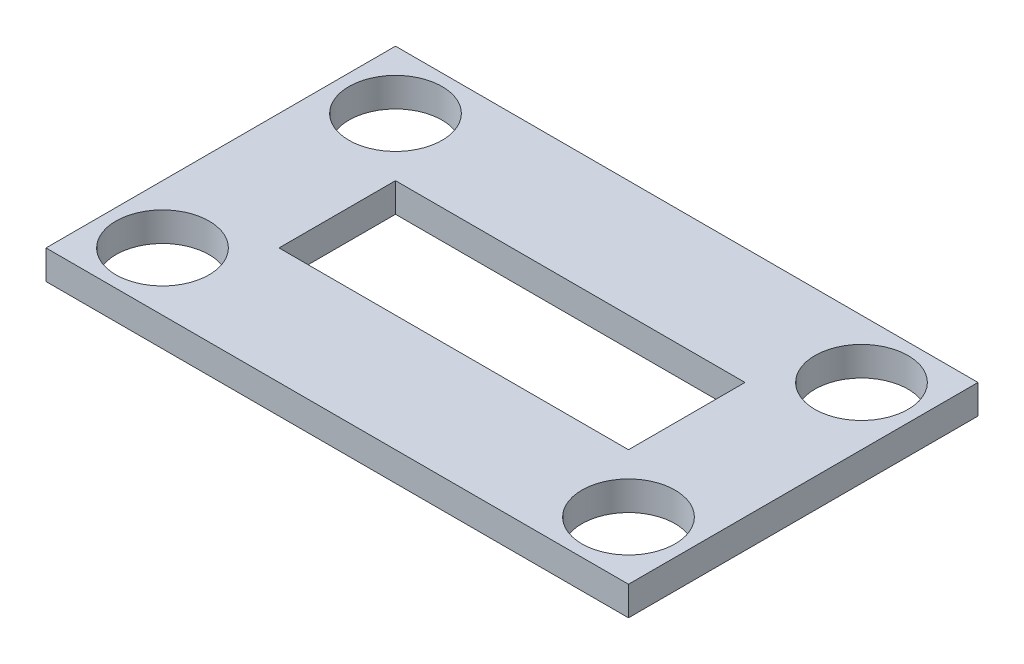
ISO-10303-21;
HEADER;
FILE_DESCRIPTION(('STEP AP214'),'2;1');
FILE_NAME('part.step','',(''),(''),'','','');
FILE_SCHEMA(('AUTOMOTIVE_DESIGN { 1 0 10303 214 1 1 1 1 }'));
ENDSEC;
DATA;
#1=APPLICATION_CONTEXT('core data for automotive mechanical design processes');
#2=APPLICATION_PROTOCOL_DEFINITION('international standard','automotive_design',2000,#1);
#3=PRODUCT_CONTEXT('',#1,'mechanical');
#4=PRODUCT('Part','Part','',(#3));
#5=PRODUCT_RELATED_PRODUCT_CATEGORY('part','',(#4));
#6=PRODUCT_DEFINITION_FORMATION('','',#4);
#7=PRODUCT_DEFINITION_CONTEXT('part definition',#1,'design');
#8=PRODUCT_DEFINITION('design','',#6,#7);
#9=PRODUCT_DEFINITION_SHAPE('','',#8);
#10=(LENGTH_UNIT() NAMED_UNIT(*) SI_UNIT(.MILLI.,.METRE.));
#11=(NAMED_UNIT(*) PLANE_ANGLE_UNIT() SI_UNIT($,.RADIAN.));
#12=(NAMED_UNIT(*) SI_UNIT($,.STERADIAN.) SOLID_ANGLE_UNIT());
#13=UNCERTAINTY_MEASURE_WITH_UNIT(LENGTH_MEASURE(1.E-05),#10,'distance_accuracy_value','');
#14=(GEOMETRIC_REPRESENTATION_CONTEXT(3) GLOBAL_UNCERTAINTY_ASSIGNED_CONTEXT((#13)) GLOBAL_UNIT_ASSIGNED_CONTEXT((#10,
#11,#12)) REPRESENTATION_CONTEXT('',''));
#15=CARTESIAN_POINT('',(0.,0.,0.));
#16=DIRECTION('',(0.,0.,1.));
#17=DIRECTION('',(1.,0.,0.));
#18=AXIS2_PLACEMENT_3D('',#15,#16,#17);
#19=CARTESIAN_POINT('',(0.,2.5,-15.));
#20=DIRECTION('',(0.,0.,1.));
#21=DIRECTION('',(1.,0.,0.));
#22=AXIS2_PLACEMENT_3D('',#19,#20,#21);
#23=PLANE('',#22);
#24=DIRECTION('',(-1.,0.,0.));
#25=VECTOR('',#24,1.);
#26=CARTESIAN_POINT('',(0.,0.,-15.));
#27=LINE('',#26,#25);
#28=CARTESIAN_POINT('',(25.,0.,-15.));
#29=VERTEX_POINT('',#28);
#30=CARTESIAN_POINT('',(-25.,0.,-15.));
#31=VERTEX_POINT('',#30);
#32=EDGE_CURVE('E163',#29,#31,#27,.T.);
#33=ORIENTED_EDGE('',*,*,#32,.T.);
#34=DIRECTION('',(0.,-1.,0.));
#35=VECTOR('',#34,1.);
#36=CARTESIAN_POINT('',(-25.,2.5,-15.));
#37=LINE('',#36,#35);
#38=CARTESIAN_POINT('',(-25.,2.5,-15.));
#39=VERTEX_POINT('',#38);
#40=EDGE_CURVE('E179',#39,#31,#37,.T.);
#41=ORIENTED_EDGE('',*,*,#40,.F.);
#42=DIRECTION('',(-1.,0.,0.));
#43=VECTOR('',#42,1.);
#44=CARTESIAN_POINT('',(0.,2.5,-15.));
#45=LINE('',#44,#43);
#46=CARTESIAN_POINT('',(25.,2.5,-15.));
#47=VERTEX_POINT('',#46);
#48=EDGE_CURVE('E142',#47,#39,#45,.T.);
#49=ORIENTED_EDGE('',*,*,#48,.F.);
#50=DIRECTION('',(0.,-1.,0.));
#51=VECTOR('',#50,1.);
#52=CARTESIAN_POINT('',(25.,2.5,-15.));
#53=LINE('',#52,#51);
#54=EDGE_CURVE('E151',#47,#29,#53,.T.);
#55=ORIENTED_EDGE('',*,*,#54,.T.);
#56=EDGE_LOOP('',(#33,#41,#49,#55));
#57=FACE_BOUND('',#56,.T.);
#58=ADVANCED_FACE('F35',(#57),#23,.F.);
#59=CARTESIAN_POINT('',(-25.,2.5,0.));
#60=DIRECTION('',(1.,0.,0.));
#61=DIRECTION('',(0.,0.,-1.));
#62=AXIS2_PLACEMENT_3D('',#59,#60,#61);
#63=PLANE('',#62);
#64=DIRECTION('',(0.,0.,1.));
#65=VECTOR('',#64,1.);
#66=CARTESIAN_POINT('',(-25.,0.,0.));
#67=LINE('',#66,#65);
#68=CARTESIAN_POINT('',(-25.,0.,15.));
#69=VERTEX_POINT('',#68);
#70=EDGE_CURVE('E166',#31,#69,#67,.T.);
#71=ORIENTED_EDGE('',*,*,#70,.T.);
#72=DIRECTION('',(0.,-1.,0.));
#73=VECTOR('',#72,1.);
#74=CARTESIAN_POINT('',(-25.,2.5,15.));
#75=LINE('',#74,#73);
#76=CARTESIAN_POINT('',(-25.,2.5,15.));
#77=VERTEX_POINT('',#76);
#78=EDGE_CURVE('E176',#77,#69,#75,.T.);
#79=ORIENTED_EDGE('',*,*,#78,.F.);
#80=DIRECTION('',(0.,0.,1.));
#81=VECTOR('',#80,1.);
#82=CARTESIAN_POINT('',(-25.,2.5,0.));
#83=LINE('',#82,#81);
#84=EDGE_CURVE('E145',#39,#77,#83,.T.);
#85=ORIENTED_EDGE('',*,*,#84,.F.);
#86=ORIENTED_EDGE('',*,*,#40,.T.);
#87=EDGE_LOOP('',(#71,#79,#85,#86));
#88=FACE_BOUND('',#87,.T.);
#89=ADVANCED_FACE('F204',(#88),#63,.F.);
#90=CARTESIAN_POINT('',(0.,2.5,15.));
#91=DIRECTION('',(0.,0.,-1.));
#92=DIRECTION('',(-1.,0.,0.));
#93=AXIS2_PLACEMENT_3D('',#90,#91,#92);
#94=PLANE('',#93);
#95=DIRECTION('',(1.,0.,0.));
#96=VECTOR('',#95,1.);
#97=CARTESIAN_POINT('',(0.,0.,15.));
#98=LINE('',#97,#96);
#99=CARTESIAN_POINT('',(25.,0.,15.));
#100=VERTEX_POINT('',#99);
#101=EDGE_CURVE('E168',#69,#100,#98,.T.);
#102=ORIENTED_EDGE('',*,*,#101,.T.);
#103=DIRECTION('',(0.,-1.,0.));
#104=VECTOR('',#103,1.);
#105=CARTESIAN_POINT('',(25.,2.5,15.));
#106=LINE('',#105,#104);
#107=CARTESIAN_POINT('',(25.,2.5,15.));
#108=VERTEX_POINT('',#107);
#109=EDGE_CURVE('E173',#108,#100,#106,.T.);
#110=ORIENTED_EDGE('',*,*,#109,.F.);
#111=DIRECTION('',(1.,0.,0.));
#112=VECTOR('',#111,1.);
#113=CARTESIAN_POINT('',(0.,2.5,15.));
#114=LINE('',#113,#112);
#115=EDGE_CURVE('E147',#77,#108,#114,.T.);
#116=ORIENTED_EDGE('',*,*,#115,.F.);
#117=ORIENTED_EDGE('',*,*,#78,.T.);
#118=EDGE_LOOP('',(#102,#110,#116,#117));
#119=FACE_BOUND('',#118,.T.);
#120=ADVANCED_FACE('F210',(#119),#94,.F.);
#121=CARTESIAN_POINT('',(-20.,2.5,10.));
#122=DIRECTION('',(0.,-1.,0.));
#123=DIRECTION('',(0.,0.,-1.));
#124=AXIS2_PLACEMENT_3D('',#121,#122,#123);
#125=CYLINDRICAL_SURFACE('',#124,4.);
#126=CARTESIAN_POINT('',(-20.,2.5,10.));
#127=DIRECTION('',(0.,1.,0.));
#128=DIRECTION('',(0.,0.,1.));
#129=AXIS2_PLACEMENT_3D('',#126,#127,#128);
#130=CIRCLE('',#129,4.);
#131=CARTESIAN_POINT('',(-20.,2.5,14.));
#132=VERTEX_POINT('',#131);
#133=EDGE_CURVE('E139',#132,#132,#130,.T.);
#134=ORIENTED_EDGE('',*,*,#133,.T.);
#135=EDGE_LOOP('',(#134));
#136=FACE_BOUND('',#135,.T.);
#137=CARTESIAN_POINT('',(-20.,0.,10.));
#138=DIRECTION('',(0.,1.,0.));
#139=DIRECTION('',(0.,0.,1.));
#140=AXIS2_PLACEMENT_3D('',#137,#138,#139);
#141=CIRCLE('',#140,4.);
#142=CARTESIAN_POINT('',(-20.,0.,14.));
#143=VERTEX_POINT('',#142);
#144=EDGE_CURVE('E160',#143,#143,#141,.T.);
#145=ORIENTED_EDGE('',*,*,#144,.F.);
#146=EDGE_LOOP('',(#145));
#147=FACE_BOUND('',#146,.T.);
#148=ADVANCED_FACE('F215',(#136,#147),#125,.F.);
#149=CARTESIAN_POINT('',(-20.,2.5,-10.));
#150=DIRECTION('',(0.,-1.,0.));
#151=DIRECTION('',(0.,0.,-1.));
#152=AXIS2_PLACEMENT_3D('',#149,#150,#151);
#153=CYLINDRICAL_SURFACE('',#152,4.);
#154=CARTESIAN_POINT('',(-20.,2.5,-10.));
#155=DIRECTION('',(0.,1.,0.));
#156=DIRECTION('',(0.,0.,1.));
#157=AXIS2_PLACEMENT_3D('',#154,#155,#156);
#158=CIRCLE('',#157,4.);
#159=CARTESIAN_POINT('',(-20.,2.5,-6.));
#160=VERTEX_POINT('',#159);
#161=EDGE_CURVE('E136',#160,#160,#158,.T.);
#162=ORIENTED_EDGE('',*,*,#161,.T.);
#163=EDGE_LOOP('',(#162));
#164=FACE_BOUND('',#163,.T.);
#165=CARTESIAN_POINT('',(-20.,0.,-10.));
#166=DIRECTION('',(0.,1.,0.));
#167=DIRECTION('',(0.,0.,1.));
#168=AXIS2_PLACEMENT_3D('',#165,#166,#167);
#169=CIRCLE('',#168,4.);
#170=CARTESIAN_POINT('',(-20.,0.,-6.));
#171=VERTEX_POINT('',#170);
#172=EDGE_CURVE('E157',#171,#171,#169,.T.);
#173=ORIENTED_EDGE('',*,*,#172,.F.);
#174=EDGE_LOOP('',(#173));
#175=FACE_BOUND('',#174,.T.);
#176=ADVANCED_FACE('F218',(#164,#175),#153,.F.);
#177=CARTESIAN_POINT('',(20.,2.5,10.));
#178=DIRECTION('',(0.,-1.,0.));
#179=DIRECTION('',(0.,0.,-1.));
#180=AXIS2_PLACEMENT_3D('',#177,#178,#179);
#181=CYLINDRICAL_SURFACE('',#180,4.);
#182=CARTESIAN_POINT('',(20.,2.5,10.));
#183=DIRECTION('',(0.,1.,0.));
#184=DIRECTION('',(0.,0.,1.));
#185=AXIS2_PLACEMENT_3D('',#182,#183,#184);
#186=CIRCLE('',#185,4.);
#187=CARTESIAN_POINT('',(20.,2.5,14.));
#188=VERTEX_POINT('',#187);
#189=EDGE_CURVE('E132',#188,#188,#186,.T.);
#190=ORIENTED_EDGE('',*,*,#189,.T.);
#191=EDGE_LOOP('',(#190));
#192=FACE_BOUND('',#191,.T.);
#193=CARTESIAN_POINT('',(20.,0.,10.));
#194=DIRECTION('',(0.,1.,0.));
#195=DIRECTION('',(0.,0.,1.));
#196=AXIS2_PLACEMENT_3D('',#193,#194,#195);
#197=CIRCLE('',#196,4.);
#198=CARTESIAN_POINT('',(20.,0.,14.));
#199=VERTEX_POINT('',#198);
#200=EDGE_CURVE('E154',#199,#199,#197,.T.);
#201=ORIENTED_EDGE('',*,*,#200,.F.);
#202=EDGE_LOOP('',(#201));
#203=FACE_BOUND('',#202,.T.);
#204=ADVANCED_FACE('F221',(#192,#203),#181,.F.);
#205=CARTESIAN_POINT('',(20.,2.5,-10.));
#206=DIRECTION('',(0.,-1.,0.));
#207=DIRECTION('',(0.,0.,-1.));
#208=AXIS2_PLACEMENT_3D('',#205,#206,#207);
#209=CYLINDRICAL_SURFACE('',#208,4.);
#210=CARTESIAN_POINT('',(20.,2.5,-10.));
#211=DIRECTION('',(0.,1.,0.));
#212=DIRECTION('',(0.,0.,1.));
#213=AXIS2_PLACEMENT_3D('',#210,#211,#212);
#214=CIRCLE('',#213,4.);
#215=CARTESIAN_POINT('',(20.,2.5,-6.));
#216=VERTEX_POINT('',#215);
#217=EDGE_CURVE('E129',#216,#216,#214,.T.);
#218=ORIENTED_EDGE('',*,*,#217,.T.);
#219=EDGE_LOOP('',(#218));
#220=FACE_BOUND('',#219,.T.);
#221=CARTESIAN_POINT('',(20.,0.,-10.));
#222=DIRECTION('',(0.,1.,0.));
#223=DIRECTION('',(0.,0.,1.));
#224=AXIS2_PLACEMENT_3D('',#221,#222,#223);
#225=CIRCLE('',#224,4.);
#226=CARTESIAN_POINT('',(20.,0.,-6.));
#227=VERTEX_POINT('',#226);
#228=EDGE_CURVE('E126',#227,#227,#225,.T.);
#229=ORIENTED_EDGE('',*,*,#228,.F.);
#230=EDGE_LOOP('',(#229));
#231=FACE_BOUND('',#230,.T.);
#232=ADVANCED_FACE('F37',(#220,#231),#209,.F.);
#233=CARTESIAN_POINT('',(25.,2.5,0.));
#234=DIRECTION('',(-1.,0.,0.));
#235=DIRECTION('',(0.,0.,1.));
#236=AXIS2_PLACEMENT_3D('',#233,#234,#235);
#237=PLANE('',#236);
#238=DIRECTION('',(0.,0.,-1.));
#239=VECTOR('',#238,1.);
#240=CARTESIAN_POINT('',(25.,0.,0.));
#241=LINE('',#240,#239);
#242=EDGE_CURVE('E133',#100,#29,#241,.T.);
#243=ORIENTED_EDGE('',*,*,#242,.T.);
#244=ORIENTED_EDGE('',*,*,#54,.F.);
#245=DIRECTION('',(0.,0.,-1.));
#246=VECTOR('',#245,1.);
#247=CARTESIAN_POINT('',(25.,2.5,0.));
#248=LINE('',#247,#246);
#249=EDGE_CURVE('E149',#108,#47,#248,.T.);
#250=ORIENTED_EDGE('',*,*,#249,.F.);
#251=ORIENTED_EDGE('',*,*,#109,.T.);
#252=EDGE_LOOP('',(#243,#244,#250,#251));
#253=FACE_BOUND('',#252,.T.);
#254=ADVANCED_FACE('F228',(#253),#237,.F.);
#255=CARTESIAN_POINT('',(0.,2.5,0.));
#256=DIRECTION('',(0.,1.,0.));
#257=DIRECTION('',(0.,0.,1.));
#258=AXIS2_PLACEMENT_3D('',#255,#256,#257);
#259=PLANE('',#258);
#260=DIRECTION('',(0.,0.,-1.));
#261=VECTOR('',#260,1.);
#262=CARTESIAN_POINT('',(15.,2.5,-5.));
#263=LINE('',#262,#261);
#264=CARTESIAN_POINT('',(15.,2.5,5.));
#265=VERTEX_POINT('',#264);
#266=CARTESIAN_POINT('',(15.,2.5,-5.));
#267=VERTEX_POINT('',#266);
#268=EDGE_CURVE('E50',#265,#267,#263,.T.);
#269=ORIENTED_EDGE('',*,*,#268,.F.);
#270=DIRECTION('',(1.,0.,0.));
#271=VECTOR('',#270,1.);
#272=CARTESIAN_POINT('',(-15.,2.5,5.));
#273=LINE('',#272,#271);
#274=CARTESIAN_POINT('',(-15.,2.5,5.));
#275=VERTEX_POINT('',#274);
#276=EDGE_CURVE('E119',#275,#265,#273,.T.);
#277=ORIENTED_EDGE('',*,*,#276,.F.);
#278=DIRECTION('',(0.,0.,1.));
#279=VECTOR('',#278,1.);
#280=CARTESIAN_POINT('',(-15.,2.5,-5.));
#281=LINE('',#280,#279);
#282=CARTESIAN_POINT('',(-15.,2.5,-5.));
#283=VERTEX_POINT('',#282);
#284=EDGE_CURVE('E103',#283,#275,#281,.T.);
#285=ORIENTED_EDGE('',*,*,#284,.F.);
#286=DIRECTION('',(-1.,0.,0.));
#287=VECTOR('',#286,1.);
#288=CARTESIAN_POINT('',(-15.,2.5,-5.));
#289=LINE('',#288,#287);
#290=EDGE_CURVE('E112',#267,#283,#289,.T.);
#291=ORIENTED_EDGE('',*,*,#290,.F.);
#292=EDGE_LOOP('',(#269,#277,#285,#291));
#293=FACE_BOUND('',#292,.T.);
#294=ORIENTED_EDGE('',*,*,#217,.F.);
#295=EDGE_LOOP('',(#294));
#296=FACE_BOUND('',#295,.T.);
#297=ORIENTED_EDGE('',*,*,#189,.F.);
#298=EDGE_LOOP('',(#297));
#299=FACE_BOUND('',#298,.T.);
#300=ORIENTED_EDGE('',*,*,#161,.F.);
#301=EDGE_LOOP('',(#300));
#302=FACE_BOUND('',#301,.T.);
#303=ORIENTED_EDGE('',*,*,#133,.F.);
#304=EDGE_LOOP('',(#303));
#305=FACE_BOUND('',#304,.T.);
#306=ORIENTED_EDGE('',*,*,#48,.T.);
#307=ORIENTED_EDGE('',*,*,#84,.T.);
#308=ORIENTED_EDGE('',*,*,#115,.T.);
#309=ORIENTED_EDGE('',*,*,#249,.T.);
#310=EDGE_LOOP('',(#306,#307,#308,#309));
#311=FACE_BOUND('',#310,.T.);
#312=ADVANCED_FACE('F116',(#293,#296,#299,#302,#305,#311),#259,.T.);
#313=CARTESIAN_POINT('',(0.,0.,0.));
#314=DIRECTION('',(0.,1.,0.));
#315=DIRECTION('',(0.,0.,1.));
#316=AXIS2_PLACEMENT_3D('',#313,#314,#315);
#317=PLANE('',#316);
#318=DIRECTION('',(1.,0.,0.));
#319=VECTOR('',#318,1.);
#320=CARTESIAN_POINT('',(0.,0.,5.));
#321=LINE('',#320,#319);
#322=CARTESIAN_POINT('',(-15.,0.,5.));
#323=VERTEX_POINT('',#322);
#324=CARTESIAN_POINT('',(15.,0.,5.));
#325=VERTEX_POINT('',#324);
#326=EDGE_CURVE('E43',#323,#325,#321,.T.);
#327=ORIENTED_EDGE('',*,*,#326,.T.);
#328=DIRECTION('',(0.,0.,-1.));
#329=VECTOR('',#328,1.);
#330=CARTESIAN_POINT('',(15.,0.,0.));
#331=LINE('',#330,#329);
#332=CARTESIAN_POINT('',(15.,0.,-5.));
#333=VERTEX_POINT('',#332);
#334=EDGE_CURVE('E11',#325,#333,#331,.T.);
#335=ORIENTED_EDGE('',*,*,#334,.T.);
#336=DIRECTION('',(-1.,0.,0.));
#337=VECTOR('',#336,1.);
#338=CARTESIAN_POINT('',(0.,0.,-5.));
#339=LINE('',#338,#337);
#340=CARTESIAN_POINT('',(-15.,0.,-5.));
#341=VERTEX_POINT('',#340);
#342=EDGE_CURVE('E182',#333,#341,#339,.T.);
#343=ORIENTED_EDGE('',*,*,#342,.T.);
#344=DIRECTION('',(0.,0.,1.));
#345=VECTOR('',#344,1.);
#346=CARTESIAN_POINT('',(-15.,0.,0.));
#347=LINE('',#346,#345);
#348=EDGE_CURVE('E106',#341,#323,#347,.T.);
#349=ORIENTED_EDGE('',*,*,#348,.T.);
#350=EDGE_LOOP('',(#327,#335,#343,#349));
#351=FACE_BOUND('',#350,.T.);
#352=ORIENTED_EDGE('',*,*,#228,.T.);
#353=EDGE_LOOP('',(#352));
#354=FACE_BOUND('',#353,.T.);
#355=ORIENTED_EDGE('',*,*,#200,.T.);
#356=EDGE_LOOP('',(#355));
#357=FACE_BOUND('',#356,.T.);
#358=ORIENTED_EDGE('',*,*,#172,.T.);
#359=EDGE_LOOP('',(#358));
#360=FACE_BOUND('',#359,.T.);
#361=ORIENTED_EDGE('',*,*,#144,.T.);
#362=EDGE_LOOP('',(#361));
#363=FACE_BOUND('',#362,.T.);
#364=ORIENTED_EDGE('',*,*,#32,.F.);
#365=ORIENTED_EDGE('',*,*,#242,.F.);
#366=ORIENTED_EDGE('',*,*,#101,.F.);
#367=ORIENTED_EDGE('',*,*,#70,.F.);
#368=EDGE_LOOP('',(#364,#365,#366,#367));
#369=FACE_BOUND('',#368,.T.);
#370=ADVANCED_FACE('F186',(#351,#354,#357,#360,#363,#369),#317,.F.);
#371=CARTESIAN_POINT('',(15.,-2.5,-5.));
#372=DIRECTION('',(1.,0.,0.));
#373=DIRECTION('',(0.,0.,-1.));
#374=AXIS2_PLACEMENT_3D('',#371,#372,#373);
#375=PLANE('',#374);
#376=DIRECTION('',(0.,1.,0.));
#377=VECTOR('',#376,1.);
#378=CARTESIAN_POINT('',(15.,-2.5,5.));
#379=LINE('',#378,#377);
#380=EDGE_CURVE('E124',#325,#265,#379,.T.);
#381=ORIENTED_EDGE('',*,*,#380,.T.);
#382=ORIENTED_EDGE('',*,*,#268,.T.);
#383=DIRECTION('',(0.,1.,0.));
#384=VECTOR('',#383,1.);
#385=CARTESIAN_POINT('',(15.,-2.5,-5.));
#386=LINE('',#385,#384);
#387=EDGE_CURVE('E109',#333,#267,#386,.T.);
#388=ORIENTED_EDGE('',*,*,#387,.F.);
#389=ORIENTED_EDGE('',*,*,#334,.F.);
#390=EDGE_LOOP('',(#381,#382,#388,#389));
#391=FACE_BOUND('',#390,.T.);
#392=ADVANCED_FACE('F191',(#391),#375,.F.);
#393=CARTESIAN_POINT('',(-15.,-2.5,5.));
#394=DIRECTION('',(0.,0.,1.));
#395=DIRECTION('',(1.,0.,0.));
#396=AXIS2_PLACEMENT_3D('',#393,#394,#395);
#397=PLANE('',#396);
#398=DIRECTION('',(0.,1.,0.));
#399=VECTOR('',#398,1.);
#400=CARTESIAN_POINT('',(-15.,-2.5,5.));
#401=LINE('',#400,#399);
#402=EDGE_CURVE('E108',#323,#275,#401,.T.);
#403=ORIENTED_EDGE('',*,*,#402,.T.);
#404=ORIENTED_EDGE('',*,*,#276,.T.);
#405=ORIENTED_EDGE('',*,*,#380,.F.);
#406=ORIENTED_EDGE('',*,*,#326,.F.);
#407=EDGE_LOOP('',(#403,#404,#405,#406));
#408=FACE_BOUND('',#407,.T.);
#409=ADVANCED_FACE('F190',(#408),#397,.F.);
#410=CARTESIAN_POINT('',(-15.,-2.5,-5.));
#411=DIRECTION('',(-1.,0.,0.));
#412=DIRECTION('',(0.,0.,1.));
#413=AXIS2_PLACEMENT_3D('',#410,#411,#412);
#414=PLANE('',#413);
#415=DIRECTION('',(0.,1.,0.));
#416=VECTOR('',#415,1.);
#417=CARTESIAN_POINT('',(-15.,-2.5,-5.));
#418=LINE('',#417,#416);
#419=EDGE_CURVE('E58',#341,#283,#418,.T.);
#420=ORIENTED_EDGE('',*,*,#419,.T.);
#421=ORIENTED_EDGE('',*,*,#284,.T.);
#422=ORIENTED_EDGE('',*,*,#402,.F.);
#423=ORIENTED_EDGE('',*,*,#348,.F.);
#424=EDGE_LOOP('',(#420,#421,#422,#423));
#425=FACE_BOUND('',#424,.T.);
#426=ADVANCED_FACE('F100',(#425),#414,.F.);
#427=CARTESIAN_POINT('',(-15.,-2.5,-5.));
#428=DIRECTION('',(0.,0.,-1.));
#429=DIRECTION('',(-1.,0.,0.));
#430=AXIS2_PLACEMENT_3D('',#427,#428,#429);
#431=PLANE('',#430);
#432=ORIENTED_EDGE('',*,*,#387,.T.);
#433=ORIENTED_EDGE('',*,*,#290,.T.);
#434=ORIENTED_EDGE('',*,*,#419,.F.);
#435=ORIENTED_EDGE('',*,*,#342,.F.);
#436=EDGE_LOOP('',(#432,#433,#434,#435));
#437=FACE_BOUND('',#436,.T.);
#438=ADVANCED_FACE('F113',(#437),#431,.F.);
#439=CLOSED_SHELL('',(#58,#89,#120,#148,#176,#204,#232,#254,#312,#370,#392,#409,#426,#438));
#440=MANIFOLD_SOLID_BREP('B2',#439);
#441=ADVANCED_BREP_SHAPE_REPRESENTATION('',(#18,#440),#14);
#442=SHAPE_DEFINITION_REPRESENTATION(#9,#441);
ENDSEC;
END-ISO-10303-21;
